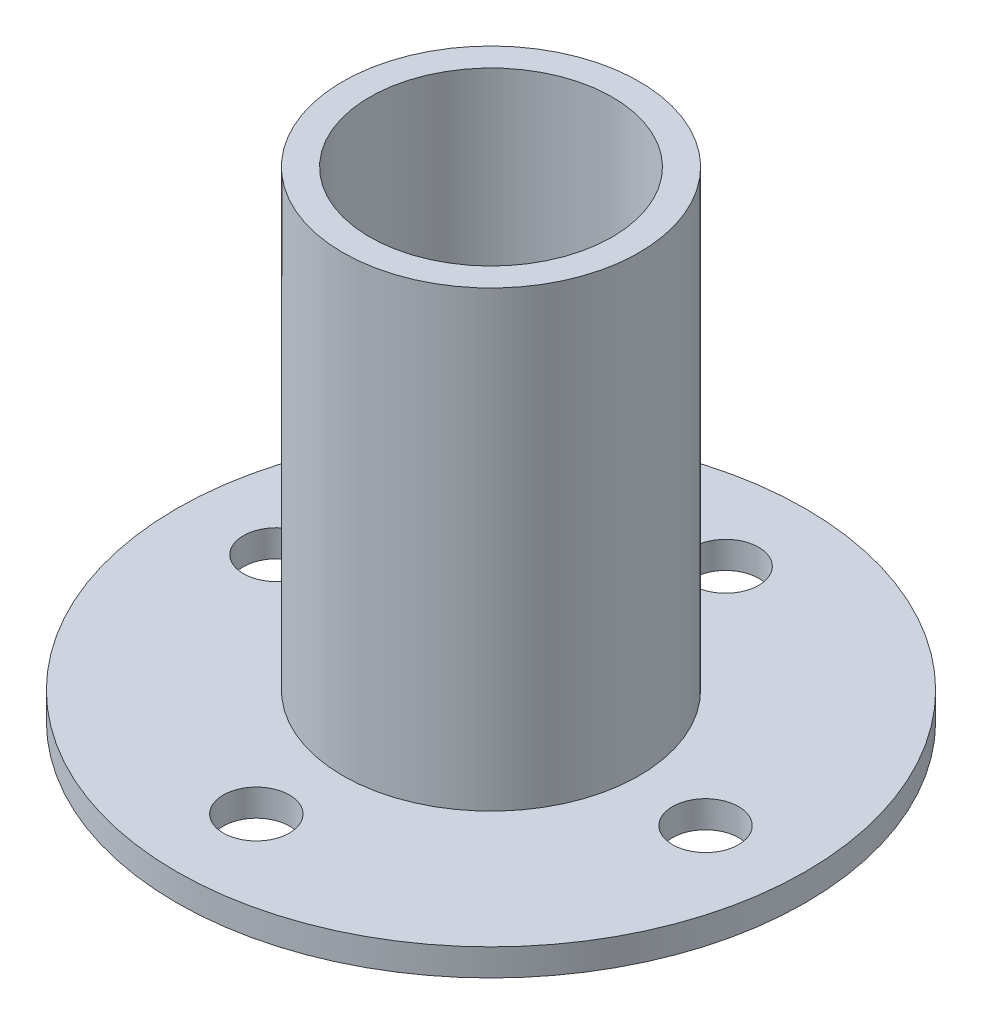
ISO-10303-21;
HEADER;
FILE_DESCRIPTION(('STEP AP214'),'2;1');
FILE_NAME('part.step','',(''),(''),'','','');
FILE_SCHEMA(('AUTOMOTIVE_DESIGN { 1 0 10303 214 1 1 1 1 }'));
ENDSEC;
DATA;
#1=APPLICATION_CONTEXT('core data for automotive mechanical design processes');
#2=APPLICATION_PROTOCOL_DEFINITION('international standard','automotive_design',2000,#1);
#3=PRODUCT_CONTEXT('',#1,'mechanical');
#4=PRODUCT('Part','Part','',(#3));
#5=PRODUCT_RELATED_PRODUCT_CATEGORY('part','',(#4));
#6=PRODUCT_DEFINITION_FORMATION('','',#4);
#7=PRODUCT_DEFINITION_CONTEXT('part definition',#1,'design');
#8=PRODUCT_DEFINITION('design','',#6,#7);
#9=PRODUCT_DEFINITION_SHAPE('','',#8);
#10=(LENGTH_UNIT() NAMED_UNIT(*) SI_UNIT(.MILLI.,.METRE.));
#11=(NAMED_UNIT(*) PLANE_ANGLE_UNIT() SI_UNIT($,.RADIAN.));
#12=(NAMED_UNIT(*) SI_UNIT($,.STERADIAN.) SOLID_ANGLE_UNIT());
#13=UNCERTAINTY_MEASURE_WITH_UNIT(LENGTH_MEASURE(1.E-05),#10,'distance_accuracy_value','');
#14=(GEOMETRIC_REPRESENTATION_CONTEXT(3) GLOBAL_UNCERTAINTY_ASSIGNED_CONTEXT((#13)) GLOBAL_UNIT_ASSIGNED_CONTEXT((#10,
#11,#12)) REPRESENTATION_CONTEXT('',''));
#15=CARTESIAN_POINT('',(0.,0.,0.));
#16=DIRECTION('',(0.,0.,1.));
#17=DIRECTION('',(1.,0.,0.));
#18=AXIS2_PLACEMENT_3D('',#15,#16,#17);
#19=CARTESIAN_POINT('',(0.,53.43,0.));
#20=DIRECTION('',(0.,1.,0.));
#21=DIRECTION('',(0.,0.,1.));
#22=AXIS2_PLACEMENT_3D('',#19,#20,#21);
#23=PLANE('',#22);
#24=CARTESIAN_POINT('',(0.,53.43,0.));
#25=DIRECTION('',(0.,1.,0.));
#26=DIRECTION('',(0.,0.,1.));
#27=AXIS2_PLACEMENT_3D('',#24,#25,#26);
#28=CIRCLE('',#27,16.5);
#29=CARTESIAN_POINT('',(0.,53.43,16.5));
#30=VERTEX_POINT('',#29);
#31=EDGE_CURVE('E12',#30,#30,#28,.T.);
#32=ORIENTED_EDGE('',*,*,#31,.T.);
#33=EDGE_LOOP('',(#32));
#34=FACE_BOUND('',#33,.T.);
#35=CARTESIAN_POINT('',(0.,53.43,0.));
#36=DIRECTION('',(0.,1.,0.));
#37=DIRECTION('',(1.,0.,0.));
#38=AXIS2_PLACEMENT_3D('',#35,#36,#37);
#39=CIRCLE('',#38,13.5);
#40=CARTESIAN_POINT('',(13.5,53.43,0.));
#41=VERTEX_POINT('',#40);
#42=EDGE_CURVE('E57',#41,#41,#39,.T.);
#43=ORIENTED_EDGE('',*,*,#42,.F.);
#44=EDGE_LOOP('',(#43));
#45=FACE_BOUND('',#44,.T.);
#46=ADVANCED_FACE('F46',(#34,#45),#23,.T.);
#47=CARTESIAN_POINT('',(0.,3.,0.));
#48=DIRECTION('',(0.,1.,0.));
#49=DIRECTION('',(0.,0.,1.));
#50=AXIS2_PLACEMENT_3D('',#47,#48,#49);
#51=PLANE('',#50);
#52=CARTESIAN_POINT('',(0.,3.,0.));
#53=DIRECTION('',(0.,1.,0.));
#54=DIRECTION('',(0.,0.,1.));
#55=AXIS2_PLACEMENT_3D('',#52,#53,#54);
#56=CIRCLE('',#55,16.5);
#57=CARTESIAN_POINT('',(0.,3.,16.5));
#58=VERTEX_POINT('',#57);
#59=EDGE_CURVE('E50',#58,#58,#56,.T.);
#60=ORIENTED_EDGE('',*,*,#59,.F.);
#61=EDGE_LOOP('',(#60));
#62=FACE_BOUND('',#61,.T.);
#63=CARTESIAN_POINT('',(0.,3.,0.));
#64=DIRECTION('',(0.,1.,0.));
#65=DIRECTION('',(1.,0.,0.));
#66=AXIS2_PLACEMENT_3D('',#63,#64,#65);
#67=CIRCLE('',#66,13.5);
#68=CARTESIAN_POINT('',(13.5,3.,0.));
#69=VERTEX_POINT('',#68);
#70=EDGE_CURVE('E59',#69,#69,#67,.T.);
#71=ORIENTED_EDGE('',*,*,#70,.T.);
#72=EDGE_LOOP('',(#71));
#73=FACE_BOUND('',#72,.T.);
#74=ADVANCED_FACE('F69',(#62,#73),#51,.F.);
#75=CARTESIAN_POINT('',(0.,53.43,0.));
#76=DIRECTION('',(0.,-1.,0.));
#77=DIRECTION('',(0.,0.,-1.));
#78=AXIS2_PLACEMENT_3D('',#75,#76,#77);
#79=CYLINDRICAL_SURFACE('',#78,16.5);
#80=ORIENTED_EDGE('',*,*,#31,.F.);
#81=EDGE_LOOP('',(#80));
#82=FACE_BOUND('',#81,.T.);
#83=ORIENTED_EDGE('',*,*,#59,.T.);
#84=EDGE_LOOP('',(#83));
#85=FACE_BOUND('',#84,.T.);
#86=ADVANCED_FACE('F48',(#82,#85),#79,.T.);
#87=CARTESIAN_POINT('',(0.,53.43,0.));
#88=DIRECTION('',(0.,-1.,0.));
#89=DIRECTION('',(0.,0.,-1.));
#90=AXIS2_PLACEMENT_3D('',#87,#88,#89);
#91=CYLINDRICAL_SURFACE('',#90,13.5);
#92=ORIENTED_EDGE('',*,*,#42,.T.);
#93=EDGE_LOOP('',(#92));
#94=FACE_BOUND('',#93,.T.);
#95=ORIENTED_EDGE('',*,*,#70,.F.);
#96=EDGE_LOOP('',(#95));
#97=FACE_BOUND('',#96,.T.);
#98=ADVANCED_FACE('F65',(#94,#97),#91,.F.);
#99=CLOSED_SHELL('',(#46,#74,#86,#98));
#100=MANIFOLD_SOLID_BREP('B2',#99);
#101=CARTESIAN_POINT('',(0.,3.,0.));
#102=DIRECTION('',(0.,-1.,0.));
#103=DIRECTION('',(0.,0.,-1.));
#104=AXIS2_PLACEMENT_3D('',#101,#102,#103);
#105=CYLINDRICAL_SURFACE('',#104,35.);
#106=CARTESIAN_POINT('',(0.,3.,0.));
#107=DIRECTION('',(0.,1.,0.));
#108=DIRECTION('',(0.,0.,1.));
#109=AXIS2_PLACEMENT_3D('',#106,#107,#108);
#110=CIRCLE('',#109,35.);
#111=CARTESIAN_POINT('',(0.,3.,35.));
#112=VERTEX_POINT('',#111);
#113=EDGE_CURVE('E45',#112,#112,#110,.T.);
#114=ORIENTED_EDGE('',*,*,#113,.F.);
#115=EDGE_LOOP('',(#114));
#116=FACE_BOUND('',#115,.T.);
#117=CARTESIAN_POINT('',(0.,0.,0.));
#118=DIRECTION('',(0.,1.,0.));
#119=DIRECTION('',(0.,0.,1.));
#120=AXIS2_PLACEMENT_3D('',#117,#118,#119);
#121=CIRCLE('',#120,35.);
#122=CARTESIAN_POINT('',(0.,0.,35.));
#123=VERTEX_POINT('',#122);
#124=EDGE_CURVE('E114',#123,#123,#121,.T.);
#125=ORIENTED_EDGE('',*,*,#124,.T.);
#126=EDGE_LOOP('',(#125));
#127=FACE_BOUND('',#126,.T.);
#128=ADVANCED_FACE('F107',(#116,#127),#105,.T.);
#129=CARTESIAN_POINT('',(0.,3.,0.));
#130=DIRECTION('',(0.,1.,0.));
#131=DIRECTION('',(0.,0.,1.));
#132=AXIS2_PLACEMENT_3D('',#129,#130,#131);
#133=PLANE('',#132);
#134=CARTESIAN_POINT('',(-25.,3.,-1.1194572837587));
#135=DIRECTION('',(0.,1.,0.));
#136=DIRECTION('',(1.,0.,0.));
#137=AXIS2_PLACEMENT_3D('',#134,#135,#136);
#138=CIRCLE('',#137,3.67612406468724);
#139=CARTESIAN_POINT('',(-21.3238759353128,3.,-1.11945728375871));
#140=VERTEX_POINT('',#139);
#141=EDGE_CURVE('E134',#140,#140,#138,.T.);
#142=ORIENTED_EDGE('',*,*,#141,.F.);
#143=EDGE_LOOP('',(#142));
#144=FACE_BOUND('',#143,.T.);
#145=CARTESIAN_POINT('',(-1.11945728375878,3.,25.));
#146=DIRECTION('',(0.,1.,0.));
#147=DIRECTION('',(0.,0.,-1.));
#148=AXIS2_PLACEMENT_3D('',#145,#146,#147);
#149=CIRCLE('',#148,3.67612406468724);
#150=CARTESIAN_POINT('',(-1.11945728375878,3.,21.3238759353128));
#151=VERTEX_POINT('',#150);
#152=EDGE_CURVE('E148',#151,#151,#149,.T.);
#153=ORIENTED_EDGE('',*,*,#152,.F.);
#154=EDGE_LOOP('',(#153));
#155=FACE_BOUND('',#154,.T.);
#156=CARTESIAN_POINT('',(25.,3.,1.11945728375852));
#157=DIRECTION('',(0.,1.,0.));
#158=DIRECTION('',(-1.,0.,0.));
#159=AXIS2_PLACEMENT_3D('',#156,#157,#158);
#160=CIRCLE('',#159,3.67612406468724);
#161=CARTESIAN_POINT('',(21.3238759353128,3.,1.11945728375856));
#162=VERTEX_POINT('',#161);
#163=EDGE_CURVE('E145',#162,#162,#160,.T.);
#164=ORIENTED_EDGE('',*,*,#163,.F.);
#165=EDGE_LOOP('',(#164));
#166=FACE_BOUND('',#165,.T.);
#167=CARTESIAN_POINT('',(1.11945728375878,3.,-25.));
#168=DIRECTION('',(0.,1.,0.));
#169=DIRECTION('',(0.,0.,1.));
#170=AXIS2_PLACEMENT_3D('',#167,#168,#169);
#171=CIRCLE('',#170,3.67612406468724);
#172=CARTESIAN_POINT('',(1.11945728375878,3.,-21.3238759353128));
#173=VERTEX_POINT('',#172);
#174=EDGE_CURVE('E130',#173,#173,#171,.T.);
#175=ORIENTED_EDGE('',*,*,#174,.F.);
#176=EDGE_LOOP('',(#175));
#177=FACE_BOUND('',#176,.T.);
#178=CARTESIAN_POINT('',(0.,3.,0.));
#179=DIRECTION('',(0.,1.,0.));
#180=DIRECTION('',(0.,0.,1.));
#181=AXIS2_PLACEMENT_3D('',#178,#179,#180);
#182=CIRCLE('',#181,14.);
#183=CARTESIAN_POINT('',(0.,3.,14.));
#184=VERTEX_POINT('',#183);
#185=EDGE_CURVE('E122',#184,#184,#182,.T.);
#186=ORIENTED_EDGE('',*,*,#185,.F.);
#187=EDGE_LOOP('',(#186));
#188=FACE_BOUND('',#187,.T.);
#189=ORIENTED_EDGE('',*,*,#113,.T.);
#190=EDGE_LOOP('',(#189));
#191=FACE_BOUND('',#190,.T.);
#192=ADVANCED_FACE('F157',(#144,#155,#166,#177,#188,#191),#133,.T.);
#193=CARTESIAN_POINT('',(0.,0.,0.));
#194=DIRECTION('',(0.,1.,0.));
#195=DIRECTION('',(0.,0.,1.));
#196=AXIS2_PLACEMENT_3D('',#193,#194,#195);
#197=PLANE('',#196);
#198=CARTESIAN_POINT('',(-25.,0.,-1.1194572837587));
#199=DIRECTION('',(0.,1.,0.));
#200=DIRECTION('',(0.,0.,1.));
#201=AXIS2_PLACEMENT_3D('',#198,#199,#200);
#202=CIRCLE('',#201,3.67612406468724);
#203=CARTESIAN_POINT('',(-25.,0.,2.55666678092855));
#204=VERTEX_POINT('',#203);
#205=EDGE_CURVE('E110',#204,#204,#202,.T.);
#206=ORIENTED_EDGE('',*,*,#205,.T.);
#207=EDGE_LOOP('',(#206));
#208=FACE_BOUND('',#207,.T.);
#209=CARTESIAN_POINT('',(-1.11945728375878,0.,25.));
#210=DIRECTION('',(0.,1.,0.));
#211=DIRECTION('',(0.,0.,1.));
#212=AXIS2_PLACEMENT_3D('',#209,#210,#211);
#213=CIRCLE('',#212,3.67612406468724);
#214=CARTESIAN_POINT('',(-1.11945728375878,0.,28.6761240646872));
#215=VERTEX_POINT('',#214);
#216=EDGE_CURVE('E133',#215,#215,#213,.T.);
#217=ORIENTED_EDGE('',*,*,#216,.T.);
#218=EDGE_LOOP('',(#217));
#219=FACE_BOUND('',#218,.T.);
#220=CARTESIAN_POINT('',(25.,0.,1.11945728375852));
#221=DIRECTION('',(0.,1.,0.));
#222=DIRECTION('',(0.,0.,1.));
#223=AXIS2_PLACEMENT_3D('',#220,#221,#222);
#224=CIRCLE('',#223,3.67612406468724);
#225=CARTESIAN_POINT('',(25.,0.,4.79558134844577));
#226=VERTEX_POINT('',#225);
#227=EDGE_CURVE('E131',#226,#226,#224,.T.);
#228=ORIENTED_EDGE('',*,*,#227,.T.);
#229=EDGE_LOOP('',(#228));
#230=FACE_BOUND('',#229,.T.);
#231=CARTESIAN_POINT('',(1.11945728375878,0.,-25.));
#232=DIRECTION('',(0.,1.,0.));
#233=DIRECTION('',(0.,0.,1.));
#234=AXIS2_PLACEMENT_3D('',#231,#232,#233);
#235=CIRCLE('',#234,3.67612406468724);
#236=CARTESIAN_POINT('',(1.11945728375878,0.,-21.3238759353128));
#237=VERTEX_POINT('',#236);
#238=EDGE_CURVE('E127',#237,#237,#235,.T.);
#239=ORIENTED_EDGE('',*,*,#238,.T.);
#240=EDGE_LOOP('',(#239));
#241=FACE_BOUND('',#240,.T.);
#242=CARTESIAN_POINT('',(0.,0.,0.));
#243=DIRECTION('',(0.,1.,0.));
#244=DIRECTION('',(0.,0.,1.));
#245=AXIS2_PLACEMENT_3D('',#242,#243,#244);
#246=CIRCLE('',#245,14.);
#247=CARTESIAN_POINT('',(0.,0.,14.));
#248=VERTEX_POINT('',#247);
#249=EDGE_CURVE('E119',#248,#248,#246,.T.);
#250=ORIENTED_EDGE('',*,*,#249,.T.);
#251=EDGE_LOOP('',(#250));
#252=FACE_BOUND('',#251,.T.);
#253=ORIENTED_EDGE('',*,*,#124,.F.);
#254=EDGE_LOOP('',(#253));
#255=FACE_BOUND('',#254,.T.);
#256=ADVANCED_FACE('F160',(#208,#219,#230,#241,#252,#255),#197,.F.);
#257=CARTESIAN_POINT('',(0.,-3.,0.));
#258=DIRECTION('',(0.,1.,0.));
#259=DIRECTION('',(0.,0.,1.));
#260=AXIS2_PLACEMENT_3D('',#257,#258,#259);
#261=CYLINDRICAL_SURFACE('',#260,14.);
#262=ORIENTED_EDGE('',*,*,#185,.T.);
#263=EDGE_LOOP('',(#262));
#264=FACE_BOUND('',#263,.T.);
#265=ORIENTED_EDGE('',*,*,#249,.F.);
#266=EDGE_LOOP('',(#265));
#267=FACE_BOUND('',#266,.T.);
#268=ADVANCED_FACE('F170',(#264,#267),#261,.F.);
#269=CARTESIAN_POINT('',(1.11945728375878,-3.,-25.));
#270=DIRECTION('',(0.,1.,0.));
#271=DIRECTION('',(0.,0.,1.));
#272=AXIS2_PLACEMENT_3D('',#269,#270,#271);
#273=CYLINDRICAL_SURFACE('',#272,3.67612406468724);
#274=ORIENTED_EDGE('',*,*,#174,.T.);
#275=EDGE_LOOP('',(#274));
#276=FACE_BOUND('',#275,.T.);
#277=ORIENTED_EDGE('',*,*,#238,.F.);
#278=EDGE_LOOP('',(#277));
#279=FACE_BOUND('',#278,.T.);
#280=ADVANCED_FACE('F173',(#276,#279),#273,.F.);
#281=CARTESIAN_POINT('',(25.,-3.,1.11945728375852));
#282=DIRECTION('',(0.,1.,0.));
#283=DIRECTION('',(0.,0.,1.));
#284=AXIS2_PLACEMENT_3D('',#281,#282,#283);
#285=CYLINDRICAL_SURFACE('',#284,3.67612406468724);
#286=ORIENTED_EDGE('',*,*,#163,.T.);
#287=EDGE_LOOP('',(#286));
#288=FACE_BOUND('',#287,.T.);
#289=ORIENTED_EDGE('',*,*,#227,.F.);
#290=EDGE_LOOP('',(#289));
#291=FACE_BOUND('',#290,.T.);
#292=ADVANCED_FACE('F204',(#288,#291),#285,.F.);
#293=CARTESIAN_POINT('',(-1.11945728375878,-3.,25.));
#294=DIRECTION('',(0.,1.,0.));
#295=DIRECTION('',(0.,0.,1.));
#296=AXIS2_PLACEMENT_3D('',#293,#294,#295);
#297=CYLINDRICAL_SURFACE('',#296,3.67612406468724);
#298=ORIENTED_EDGE('',*,*,#152,.T.);
#299=EDGE_LOOP('',(#298));
#300=FACE_BOUND('',#299,.T.);
#301=ORIENTED_EDGE('',*,*,#216,.F.);
#302=EDGE_LOOP('',(#301));
#303=FACE_BOUND('',#302,.T.);
#304=ADVANCED_FACE('F210',(#300,#303),#297,.F.);
#305=CARTESIAN_POINT('',(-25.,-3.,-1.1194572837587));
#306=DIRECTION('',(0.,1.,0.));
#307=DIRECTION('',(0.,0.,1.));
#308=AXIS2_PLACEMENT_3D('',#305,#306,#307);
#309=CYLINDRICAL_SURFACE('',#308,3.67612406468724);
#310=ORIENTED_EDGE('',*,*,#141,.T.);
#311=EDGE_LOOP('',(#310));
#312=FACE_BOUND('',#311,.T.);
#313=ORIENTED_EDGE('',*,*,#205,.F.);
#314=EDGE_LOOP('',(#313));
#315=FACE_BOUND('',#314,.T.);
#316=ADVANCED_FACE('F154',(#312,#315),#309,.F.);
#317=CLOSED_SHELL('',(#128,#192,#256,#268,#280,#292,#304,#316));
#318=MANIFOLD_SOLID_BREP('B7',#317);
#319=ADVANCED_BREP_SHAPE_REPRESENTATION('',(#18,#100,#318),#14);
#320=SHAPE_DEFINITION_REPRESENTATION(#9,#319);
ENDSEC;
END-ISO-10303-21;
